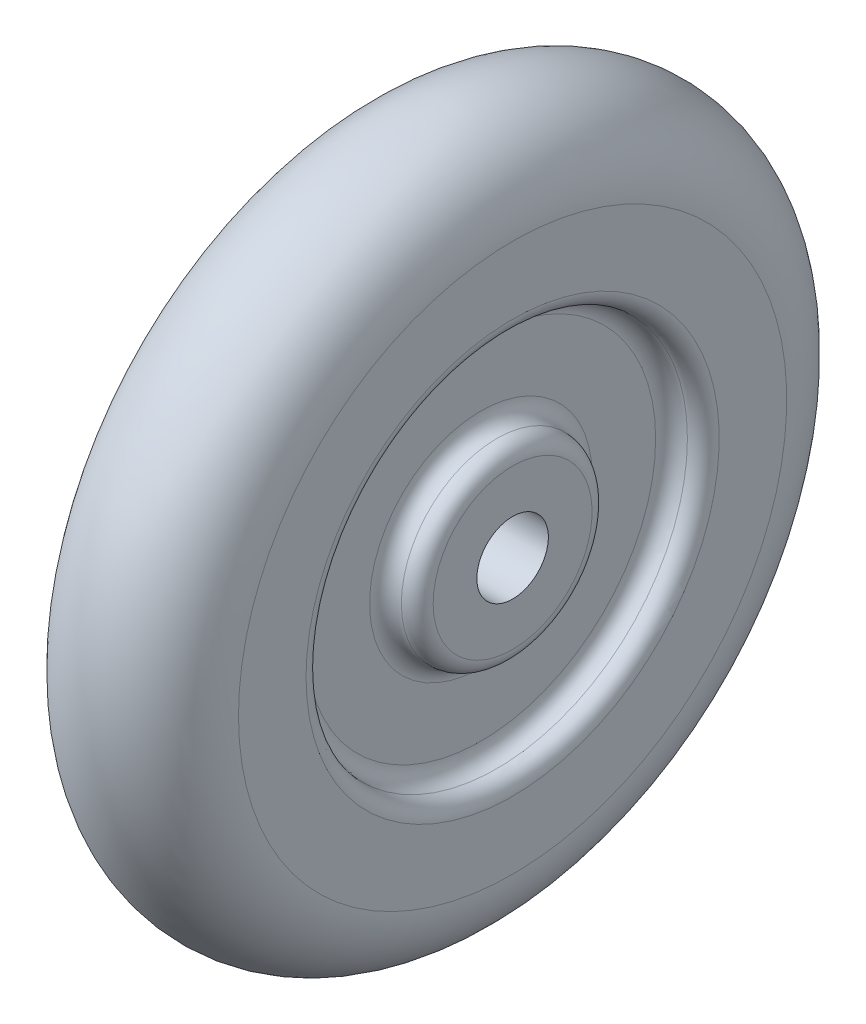
ISO-10303-21;
HEADER;
FILE_DESCRIPTION(('STEP AP214'),'2;1');
FILE_NAME('part.step','',(''),(''),'','','');
FILE_SCHEMA(('AUTOMOTIVE_DESIGN { 1 0 10303 214 1 1 1 1 }'));
ENDSEC;
DATA;
#1=APPLICATION_CONTEXT('core data for automotive mechanical design processes');
#2=APPLICATION_PROTOCOL_DEFINITION('international standard','automotive_design',2000,#1);
#3=PRODUCT_CONTEXT('',#1,'mechanical');
#4=PRODUCT('Part','Part','',(#3));
#5=PRODUCT_RELATED_PRODUCT_CATEGORY('part','',(#4));
#6=PRODUCT_DEFINITION_FORMATION('','',#4);
#7=PRODUCT_DEFINITION_CONTEXT('part definition',#1,'design');
#8=PRODUCT_DEFINITION('design','',#6,#7);
#9=PRODUCT_DEFINITION_SHAPE('','',#8);
#10=(LENGTH_UNIT() NAMED_UNIT(*) SI_UNIT(.MILLI.,.METRE.));
#11=(NAMED_UNIT(*) PLANE_ANGLE_UNIT() SI_UNIT($,.RADIAN.));
#12=(NAMED_UNIT(*) SI_UNIT($,.STERADIAN.) SOLID_ANGLE_UNIT());
#13=UNCERTAINTY_MEASURE_WITH_UNIT(LENGTH_MEASURE(1.E-05),#10,'distance_accuracy_value','');
#14=(GEOMETRIC_REPRESENTATION_CONTEXT(3) GLOBAL_UNCERTAINTY_ASSIGNED_CONTEXT((#13)) GLOBAL_UNIT_ASSIGNED_CONTEXT((#10,
#11,#12)) REPRESENTATION_CONTEXT('',''));
#15=CARTESIAN_POINT('',(0.,0.,0.));
#16=DIRECTION('',(0.,0.,1.));
#17=DIRECTION('',(1.,0.,0.));
#18=AXIS2_PLACEMENT_3D('',#15,#16,#17);
#19=CARTESIAN_POINT('',(-5.,16.4199885687019,0.));
#20=DIRECTION('',(1.,0.,0.));
#21=DIRECTION('',(0.,0.,-1.));
#22=AXIS2_PLACEMENT_3D('',#19,#20,#21);
#23=PLANE('',#22);
#24=CARTESIAN_POINT('',(-5.,-0.830011431298146,0.));
#25=DIRECTION('',(1.,0.,0.));
#26=DIRECTION('',(0.,0.,-1.));
#27=AXIS2_PLACEMENT_3D('',#24,#25,#26);
#28=CIRCLE('',#27,5.);
#29=CARTESIAN_POINT('',(-5.,-0.830011431298146,-5.));
#30=VERTEX_POINT('',#29);
#31=EDGE_CURVE('E10',#30,#30,#28,.F.);
#32=ORIENTED_EDGE('',*,*,#31,.T.);
#33=EDGE_LOOP('',(#32));
#34=FACE_BOUND('',#33,.T.);
#35=CARTESIAN_POINT('',(-5.,-0.830011431298146,0.));
#36=DIRECTION('',(-1.,0.,0.));
#37=DIRECTION('',(0.,0.,1.));
#38=AXIS2_PLACEMENT_3D('',#35,#36,#37);
#39=CIRCLE('',#38,2.25);
#40=CARTESIAN_POINT('',(-5.,-0.830011431298146,2.25));
#41=VERTEX_POINT('',#40);
#42=EDGE_CURVE('E105',#41,#41,#39,.T.);
#43=ORIENTED_EDGE('',*,*,#42,.F.);
#44=EDGE_LOOP('',(#43));
#45=FACE_BOUND('',#44,.T.);
#46=ADVANCED_FACE('F34',(#34,#45),#23,.F.);
#47=CARTESIAN_POINT('',(5.,16.4199885687019,0.));
#48=DIRECTION('',(-1.,0.,0.));
#49=DIRECTION('',(0.,0.,1.));
#50=AXIS2_PLACEMENT_3D('',#47,#48,#49);
#51=PLANE('',#50);
#52=CARTESIAN_POINT('',(5.,-0.830011431298146,0.));
#53=DIRECTION('',(-1.,0.,0.));
#54=DIRECTION('',(0.,0.,1.));
#55=AXIS2_PLACEMENT_3D('',#52,#53,#54);
#56=CIRCLE('',#55,5.);
#57=CARTESIAN_POINT('',(5.,-0.830011431298146,5.));
#58=VERTEX_POINT('',#57);
#59=EDGE_CURVE('E120',#58,#58,#56,.F.);
#60=ORIENTED_EDGE('',*,*,#59,.T.);
#61=EDGE_LOOP('',(#60));
#62=FACE_BOUND('',#61,.T.);
#63=CARTESIAN_POINT('',(5.,-0.830011431298146,0.));
#64=DIRECTION('',(-1.,0.,0.));
#65=DIRECTION('',(0.,0.,1.));
#66=AXIS2_PLACEMENT_3D('',#63,#64,#65);
#67=CIRCLE('',#66,2.25);
#68=CARTESIAN_POINT('',(5.,-0.830011431298146,2.25));
#69=VERTEX_POINT('',#68);
#70=EDGE_CURVE('E111',#69,#69,#67,.T.);
#71=ORIENTED_EDGE('',*,*,#70,.T.);
#72=EDGE_LOOP('',(#71));
#73=FACE_BOUND('',#72,.T.);
#74=ADVANCED_FACE('F74',(#62,#73),#51,.F.);
#75=CARTESIAN_POINT('',(5.,-0.830011431298146,0.));
#76=DIRECTION('',(-1.,0.,0.));
#77=DIRECTION('',(0.,0.,1.));
#78=AXIS2_PLACEMENT_3D('',#75,#76,#77);
#79=CIRCLE('',#78,13.);
#80=CARTESIAN_POINT('',(5.,-0.830011431298146,13.));
#81=VERTEX_POINT('',#80);
#82=EDGE_CURVE('E123',#81,#81,#79,.T.);
#83=ORIENTED_EDGE('',*,*,#82,.T.);
#84=EDGE_LOOP('',(#83));
#85=FACE_BOUND('',#84,.T.);
#86=CARTESIAN_POINT('',(5.,-0.830011431298146,0.));
#87=DIRECTION('',(-1.,0.,0.));
#88=DIRECTION('',(0.,0.,1.));
#89=AXIS2_PLACEMENT_3D('',#86,#87,#88);
#90=CIRCLE('',#89,17.25);
#91=CARTESIAN_POINT('',(5.,-0.830011431298146,17.25));
#92=VERTEX_POINT('',#91);
#93=EDGE_CURVE('E104',#92,#92,#90,.T.);
#94=ORIENTED_EDGE('',*,*,#93,.F.);
#95=EDGE_LOOP('',(#94));
#96=FACE_BOUND('',#95,.T.);
#97=ADVANCED_FACE('F80',(#85,#96),#51,.F.);
#98=CARTESIAN_POINT('',(0.,-0.830011431298145,0.));
#99=DIRECTION('',(-1.,0.,0.));
#100=DIRECTION('',(0.,0.,1.));
#101=AXIS2_PLACEMENT_3D('',#98,#99,#100);
#102=TOROIDAL_SURFACE('',#101,17.25,5.);
#103=CARTESIAN_POINT('',(-5.,-0.830011431298146,0.));
#104=DIRECTION('',(-1.,0.,0.));
#105=DIRECTION('',(0.,0.,1.));
#106=AXIS2_PLACEMENT_3D('',#103,#104,#105);
#107=CIRCLE('',#106,17.25);
#108=CARTESIAN_POINT('',(-5.,-0.830011431298146,17.25));
#109=VERTEX_POINT('',#108);
#110=EDGE_CURVE('E103',#109,#109,#107,.T.);
#111=ORIENTED_EDGE('',*,*,#110,.F.);
#112=EDGE_LOOP('',(#111));
#113=FACE_BOUND('',#112,.T.);
#114=ORIENTED_EDGE('',*,*,#93,.T.);
#115=EDGE_LOOP('',(#114));
#116=FACE_BOUND('',#115,.T.);
#117=ADVANCED_FACE('F88',(#113,#116),#102,.T.);
#118=CARTESIAN_POINT('',(-5.,-0.830011431298146,0.));
#119=DIRECTION('',(1.,0.,0.));
#120=DIRECTION('',(0.,0.,-1.));
#121=AXIS2_PLACEMENT_3D('',#118,#119,#120);
#122=CIRCLE('',#121,13.);
#123=CARTESIAN_POINT('',(-5.,-0.830011431298146,-13.));
#124=VERTEX_POINT('',#123);
#125=EDGE_CURVE('E100',#124,#124,#122,.T.);
#126=ORIENTED_EDGE('',*,*,#125,.T.);
#127=EDGE_LOOP('',(#126));
#128=FACE_BOUND('',#127,.T.);
#129=ORIENTED_EDGE('',*,*,#110,.T.);
#130=EDGE_LOOP('',(#129));
#131=FACE_BOUND('',#130,.T.);
#132=ADVANCED_FACE('F76',(#128,#131),#23,.F.);
#133=CARTESIAN_POINT('',(-11.2517936179789,-0.830011431298146,0.));
#134=DIRECTION('',(-1.,0.,0.));
#135=DIRECTION('',(0.,0.,1.));
#136=AXIS2_PLACEMENT_3D('',#133,#134,#135);
#137=CYLINDRICAL_SURFACE('',#136,2.25);
#138=ORIENTED_EDGE('',*,*,#70,.F.);
#139=EDGE_LOOP('',(#138));
#140=FACE_BOUND('',#139,.T.);
#141=ORIENTED_EDGE('',*,*,#42,.T.);
#142=EDGE_LOOP('',(#141));
#143=FACE_BOUND('',#142,.T.);
#144=ADVANCED_FACE('F87',(#140,#143),#137,.F.);
#145=CARTESIAN_POINT('',(3.,-0.830011431298146,0.));
#146=DIRECTION('',(1.,0.,0.));
#147=DIRECTION('',(0.,0.,-1.));
#148=AXIS2_PLACEMENT_3D('',#145,#146,#147);
#149=PLANE('',#148);
#150=CARTESIAN_POINT('',(3.,-0.830011431298146,0.));
#151=DIRECTION('',(1.,0.,0.));
#152=DIRECTION('',(0.,0.,-1.));
#153=AXIS2_PLACEMENT_3D('',#150,#151,#152);
#154=CIRCLE('',#153,7.);
#155=CARTESIAN_POINT('',(3.,-0.830011431298146,-7.));
#156=VERTEX_POINT('',#155);
#157=EDGE_CURVE('E117',#156,#156,#154,.F.);
#158=ORIENTED_EDGE('',*,*,#157,.T.);
#159=EDGE_LOOP('',(#158));
#160=FACE_BOUND('',#159,.T.);
#161=CARTESIAN_POINT('',(3.,-0.830011431298146,0.));
#162=DIRECTION('',(1.,0.,0.));
#163=DIRECTION('',(0.,0.,-1.));
#164=AXIS2_PLACEMENT_3D('',#161,#162,#163);
#165=CIRCLE('',#164,11.);
#166=CARTESIAN_POINT('',(3.,-0.830011431298146,-11.));
#167=VERTEX_POINT('',#166);
#168=EDGE_CURVE('E108',#167,#167,#165,.T.);
#169=ORIENTED_EDGE('',*,*,#168,.T.);
#170=EDGE_LOOP('',(#169));
#171=FACE_BOUND('',#170,.T.);
#172=ADVANCED_FACE('F94',(#160,#171),#149,.T.);
#173=CARTESIAN_POINT('',(4.,-0.830011431298146,0.));
#174=DIRECTION('',(-1.,0.,0.));
#175=DIRECTION('',(0.,0.,1.));
#176=AXIS2_PLACEMENT_3D('',#173,#174,#175);
#177=TOROIDAL_SURFACE('',#176,5.,1.);
#178=ORIENTED_EDGE('',*,*,#59,.F.);
#179=EDGE_LOOP('',(#178));
#180=FACE_BOUND('',#179,.T.);
#181=CARTESIAN_POINT('',(4.,-0.830011431298146,0.));
#182=DIRECTION('',(-1.,0.,0.));
#183=DIRECTION('',(0.,0.,1.));
#184=AXIS2_PLACEMENT_3D('',#181,#182,#183);
#185=CIRCLE('',#184,6.);
#186=CARTESIAN_POINT('',(4.,-0.830011431298146,6.));
#187=VERTEX_POINT('',#186);
#188=EDGE_CURVE('E56',#187,#187,#185,.T.);
#189=ORIENTED_EDGE('',*,*,#188,.F.);
#190=EDGE_LOOP('',(#189));
#191=FACE_BOUND('',#190,.T.);
#192=ADVANCED_FACE('F147',(#180,#191),#177,.T.);
#193=CARTESIAN_POINT('',(4.,-0.830011431298146,0.));
#194=DIRECTION('',(1.,0.,0.));
#195=DIRECTION('',(0.,0.,-1.));
#196=AXIS2_PLACEMENT_3D('',#193,#194,#195);
#197=TOROIDAL_SURFACE('',#196,7.,1.);
#198=ORIENTED_EDGE('',*,*,#157,.F.);
#199=EDGE_LOOP('',(#198));
#200=FACE_BOUND('',#199,.T.);
#201=ORIENTED_EDGE('',*,*,#188,.T.);
#202=EDGE_LOOP('',(#201));
#203=FACE_BOUND('',#202,.T.);
#204=ADVANCED_FACE('F152',(#200,#203),#197,.F.);
#205=CARTESIAN_POINT('',(4.,-0.830011431298146,0.));
#206=DIRECTION('',(1.,0.,0.));
#207=DIRECTION('',(0.,0.,-1.));
#208=AXIS2_PLACEMENT_3D('',#205,#206,#207);
#209=TOROIDAL_SURFACE('',#208,11.,1.);
#210=ORIENTED_EDGE('',*,*,#168,.F.);
#211=EDGE_LOOP('',(#210));
#212=FACE_BOUND('',#211,.T.);
#213=CARTESIAN_POINT('',(4.,-0.830011431298146,0.));
#214=DIRECTION('',(1.,0.,0.));
#215=DIRECTION('',(0.,0.,-1.));
#216=AXIS2_PLACEMENT_3D('',#213,#214,#215);
#217=CIRCLE('',#216,12.);
#218=CARTESIAN_POINT('',(4.,-0.830011431298146,-12.));
#219=VERTEX_POINT('',#218);
#220=EDGE_CURVE('E52',#219,#219,#217,.F.);
#221=ORIENTED_EDGE('',*,*,#220,.F.);
#222=EDGE_LOOP('',(#221));
#223=FACE_BOUND('',#222,.T.);
#224=ADVANCED_FACE('F142',(#212,#223),#209,.F.);
#225=CARTESIAN_POINT('',(4.,-0.830011431298146,0.));
#226=DIRECTION('',(-1.,0.,0.));
#227=DIRECTION('',(0.,0.,1.));
#228=AXIS2_PLACEMENT_3D('',#225,#226,#227);
#229=TOROIDAL_SURFACE('',#228,13.,1.);
#230=ORIENTED_EDGE('',*,*,#82,.F.);
#231=EDGE_LOOP('',(#230));
#232=FACE_BOUND('',#231,.T.);
#233=ORIENTED_EDGE('',*,*,#220,.T.);
#234=EDGE_LOOP('',(#233));
#235=FACE_BOUND('',#234,.T.);
#236=ADVANCED_FACE('F133',(#232,#235),#229,.T.);
#237=CARTESIAN_POINT('',(-3.,-0.830011431298146,0.));
#238=DIRECTION('',(-1.,0.,0.));
#239=DIRECTION('',(0.,0.,-1.));
#240=AXIS2_PLACEMENT_3D('',#237,#238,#239);
#241=PLANE('',#240);
#242=CARTESIAN_POINT('',(-3.,-0.830011431298146,0.));
#243=DIRECTION('',(-1.,0.,0.));
#244=DIRECTION('',(0.,0.,1.));
#245=AXIS2_PLACEMENT_3D('',#242,#243,#244);
#246=CIRCLE('',#245,11.);
#247=CARTESIAN_POINT('',(-3.,-0.830011431298146,11.));
#248=VERTEX_POINT('',#247);
#249=EDGE_CURVE('E42',#248,#248,#246,.T.);
#250=ORIENTED_EDGE('',*,*,#249,.T.);
#251=EDGE_LOOP('',(#250));
#252=FACE_BOUND('',#251,.T.);
#253=CARTESIAN_POINT('',(-3.,-0.830011431298146,0.));
#254=DIRECTION('',(-1.,0.,0.));
#255=DIRECTION('',(0.,0.,1.));
#256=AXIS2_PLACEMENT_3D('',#253,#254,#255);
#257=CIRCLE('',#256,7.);
#258=CARTESIAN_POINT('',(-3.,-0.830011431298146,7.));
#259=VERTEX_POINT('',#258);
#260=EDGE_CURVE('E47',#259,#259,#257,.F.);
#261=ORIENTED_EDGE('',*,*,#260,.T.);
#262=EDGE_LOOP('',(#261));
#263=FACE_BOUND('',#262,.T.);
#264=ADVANCED_FACE('F131',(#252,#263),#241,.T.);
#265=CARTESIAN_POINT('',(-4.,-0.830011431298146,0.));
#266=DIRECTION('',(-1.,0.,0.));
#267=DIRECTION('',(0.,0.,1.));
#268=AXIS2_PLACEMENT_3D('',#265,#266,#267);
#269=TOROIDAL_SURFACE('',#268,11.,1.);
#270=ORIENTED_EDGE('',*,*,#249,.F.);
#271=EDGE_LOOP('',(#270));
#272=FACE_BOUND('',#271,.T.);
#273=CARTESIAN_POINT('',(-4.,-0.830011431298146,0.));
#274=DIRECTION('',(-1.,0.,0.));
#275=DIRECTION('',(0.,0.,1.));
#276=AXIS2_PLACEMENT_3D('',#273,#274,#275);
#277=CIRCLE('',#276,12.);
#278=CARTESIAN_POINT('',(-4.,-0.830011431298146,12.));
#279=VERTEX_POINT('',#278);
#280=EDGE_CURVE('E50',#279,#279,#277,.F.);
#281=ORIENTED_EDGE('',*,*,#280,.F.);
#282=EDGE_LOOP('',(#281));
#283=FACE_BOUND('',#282,.T.);
#284=ADVANCED_FACE('F71',(#272,#283),#269,.F.);
#285=CARTESIAN_POINT('',(-4.,-0.830011431298146,0.));
#286=DIRECTION('',(1.,0.,0.));
#287=DIRECTION('',(0.,0.,-1.));
#288=AXIS2_PLACEMENT_3D('',#285,#286,#287);
#289=TOROIDAL_SURFACE('',#288,13.,1.);
#290=ORIENTED_EDGE('',*,*,#280,.T.);
#291=EDGE_LOOP('',(#290));
#292=FACE_BOUND('',#291,.T.);
#293=ORIENTED_EDGE('',*,*,#125,.F.);
#294=EDGE_LOOP('',(#293));
#295=FACE_BOUND('',#294,.T.);
#296=ADVANCED_FACE('F65',(#292,#295),#289,.T.);
#297=CARTESIAN_POINT('',(-4.,-0.830011431298146,0.));
#298=DIRECTION('',(1.,0.,0.));
#299=DIRECTION('',(0.,0.,-1.));
#300=AXIS2_PLACEMENT_3D('',#297,#298,#299);
#301=TOROIDAL_SURFACE('',#300,5.,1.);
#302=ORIENTED_EDGE('',*,*,#31,.F.);
#303=EDGE_LOOP('',(#302));
#304=FACE_BOUND('',#303,.T.);
#305=CARTESIAN_POINT('',(-4.,-0.830011431298146,0.));
#306=DIRECTION('',(1.,0.,0.));
#307=DIRECTION('',(0.,0.,-1.));
#308=AXIS2_PLACEMENT_3D('',#305,#306,#307);
#309=CIRCLE('',#308,6.);
#310=CARTESIAN_POINT('',(-4.,-0.830011431298146,-6.));
#311=VERTEX_POINT('',#310);
#312=EDGE_CURVE('E38',#311,#311,#309,.T.);
#313=ORIENTED_EDGE('',*,*,#312,.F.);
#314=EDGE_LOOP('',(#313));
#315=FACE_BOUND('',#314,.T.);
#316=ADVANCED_FACE('F36',(#304,#315),#301,.T.);
#317=CARTESIAN_POINT('',(-4.,-0.830011431298146,0.));
#318=DIRECTION('',(-1.,0.,0.));
#319=DIRECTION('',(0.,0.,1.));
#320=AXIS2_PLACEMENT_3D('',#317,#318,#319);
#321=TOROIDAL_SURFACE('',#320,7.,1.);
#322=ORIENTED_EDGE('',*,*,#312,.T.);
#323=EDGE_LOOP('',(#322));
#324=FACE_BOUND('',#323,.T.);
#325=ORIENTED_EDGE('',*,*,#260,.F.);
#326=EDGE_LOOP('',(#325));
#327=FACE_BOUND('',#326,.T.);
#328=ADVANCED_FACE('F61',(#324,#327),#321,.F.);
#329=CLOSED_SHELL('',(#46,#74,#97,#117,#132,#144,#172,#192,#204,#224,#236,#264,#284,#296,#316,#328));
#330=MANIFOLD_SOLID_BREP('B2',#329);
#331=ADVANCED_BREP_SHAPE_REPRESENTATION('',(#18,#330),#14);
#332=SHAPE_DEFINITION_REPRESENTATION(#9,#331);
ENDSEC;
END-ISO-10303-21;
